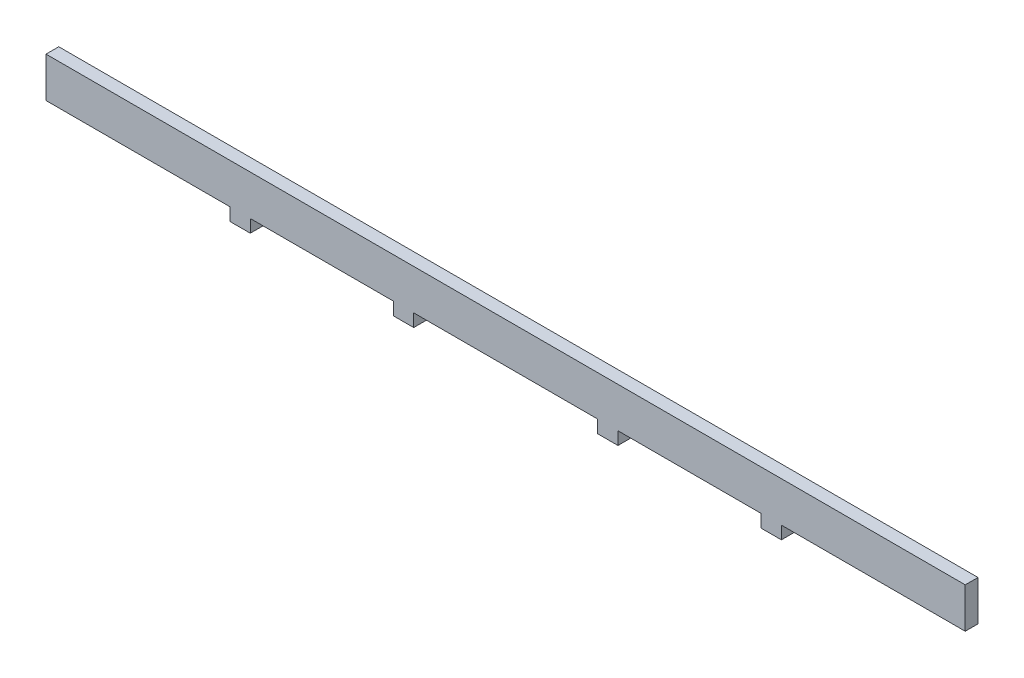
ISO-10303-21;
HEADER;
FILE_DESCRIPTION(('STEP AP214'),'2;1');
FILE_NAME('part.step','',(''),(''),'','','');
FILE_SCHEMA(('AUTOMOTIVE_DESIGN { 1 0 10303 214 1 1 1 1 }'));
ENDSEC;
DATA;
#1=APPLICATION_CONTEXT('core data for automotive mechanical design processes');
#2=APPLICATION_PROTOCOL_DEFINITION('international standard','automotive_design',2000,#1);
#3=PRODUCT_CONTEXT('',#1,'mechanical');
#4=PRODUCT('Part','Part','',(#3));
#5=PRODUCT_RELATED_PRODUCT_CATEGORY('part','',(#4));
#6=PRODUCT_DEFINITION_FORMATION('','',#4);
#7=PRODUCT_DEFINITION_CONTEXT('part definition',#1,'design');
#8=PRODUCT_DEFINITION('design','',#6,#7);
#9=PRODUCT_DEFINITION_SHAPE('','',#8);
#10=(LENGTH_UNIT() NAMED_UNIT(*) SI_UNIT(.MILLI.,.METRE.));
#11=(NAMED_UNIT(*) PLANE_ANGLE_UNIT() SI_UNIT($,.RADIAN.));
#12=(NAMED_UNIT(*) SI_UNIT($,.STERADIAN.) SOLID_ANGLE_UNIT());
#13=UNCERTAINTY_MEASURE_WITH_UNIT(LENGTH_MEASURE(1.E-05),#10,'distance_accuracy_value','');
#14=(GEOMETRIC_REPRESENTATION_CONTEXT(3) GLOBAL_UNCERTAINTY_ASSIGNED_CONTEXT((#13)) GLOBAL_UNIT_ASSIGNED_CONTEXT((#10,
#11,#12)) REPRESENTATION_CONTEXT('',''));
#15=CARTESIAN_POINT('',(0.,0.,0.));
#16=DIRECTION('',(0.,0.,1.));
#17=DIRECTION('',(1.,0.,0.));
#18=AXIS2_PLACEMENT_3D('',#15,#16,#17);
#19=CARTESIAN_POINT('',(-139.427215106676,70.106814657639,3.175));
#20=DIRECTION('',(1.,0.,0.));
#21=DIRECTION('',(0.,1.,0.));
#22=AXIS2_PLACEMENT_3D('',#19,#20,#21);
#23=PLANE('',#22);
#24=DIRECTION('',(0.,-1.,0.));
#25=VECTOR('',#24,1.);
#26=CARTESIAN_POINT('',(-139.427215106676,70.106814657639,0.));
#27=LINE('',#26,#25);
#28=CARTESIAN_POINT('',(-139.427215106676,70.106814657639,0.));
#29=VERTEX_POINT('',#28);
#30=CARTESIAN_POINT('',(-139.427215106676,60.1068146576389,0.));
#31=VERTEX_POINT('',#30);
#32=EDGE_CURVE('E201',#29,#31,#27,.T.);
#33=ORIENTED_EDGE('',*,*,#32,.T.);
#34=DIRECTION('',(0.,0.,-1.));
#35=VECTOR('',#34,1.);
#36=CARTESIAN_POINT('',(-139.427215106676,60.1068146576389,3.175));
#37=LINE('',#36,#35);
#38=CARTESIAN_POINT('',(-139.427215106676,60.1068146576389,3.175));
#39=VERTEX_POINT('',#38);
#40=EDGE_CURVE('E11',#39,#31,#37,.T.);
#41=ORIENTED_EDGE('',*,*,#40,.F.);
#42=DIRECTION('',(0.,-1.,0.));
#43=VECTOR('',#42,1.);
#44=CARTESIAN_POINT('',(-139.427215106676,70.106814657639,3.175));
#45=LINE('',#44,#43);
#46=CARTESIAN_POINT('',(-139.427215106676,70.106814657639,3.175));
#47=VERTEX_POINT('',#46);
#48=EDGE_CURVE('E239',#47,#39,#45,.T.);
#49=ORIENTED_EDGE('',*,*,#48,.F.);
#50=DIRECTION('',(0.,0.,-1.));
#51=VECTOR('',#50,1.);
#52=CARTESIAN_POINT('',(-139.427215106676,70.106814657639,3.175));
#53=LINE('',#52,#51);
#54=EDGE_CURVE('E197',#47,#29,#53,.T.);
#55=ORIENTED_EDGE('',*,*,#54,.T.);
#56=EDGE_LOOP('',(#33,#41,#49,#55));
#57=FACE_BOUND('',#56,.T.);
#58=ADVANCED_FACE('F33',(#57),#23,.F.);
#59=CARTESIAN_POINT('',(-139.427215106676,60.1068146576389,3.175));
#60=DIRECTION('',(0.,1.,0.));
#61=DIRECTION('',(-1.,0.,0.));
#62=AXIS2_PLACEMENT_3D('',#59,#60,#61);
#63=PLANE('',#62);
#64=DIRECTION('',(1.,0.,0.));
#65=VECTOR('',#64,1.);
#66=CARTESIAN_POINT('',(-139.427215106676,60.1068146576389,0.));
#67=LINE('',#66,#65);
#68=CARTESIAN_POINT('',(-93.7072151066765,60.106814657639,0.));
#69=VERTEX_POINT('',#68);
#70=EDGE_CURVE('E204',#31,#69,#67,.T.);
#71=ORIENTED_EDGE('',*,*,#70,.T.);
#72=DIRECTION('',(0.,0.,-1.));
#73=VECTOR('',#72,1.);
#74=CARTESIAN_POINT('',(-93.7072151066765,60.106814657639,3.175));
#75=LINE('',#74,#73);
#76=CARTESIAN_POINT('',(-93.7072151066765,60.106814657639,3.175));
#77=VERTEX_POINT('',#76);
#78=EDGE_CURVE('E41',#77,#69,#75,.T.);
#79=ORIENTED_EDGE('',*,*,#78,.F.);
#80=DIRECTION('',(1.,0.,0.));
#81=VECTOR('',#80,1.);
#82=CARTESIAN_POINT('',(-139.427215106676,60.1068146576389,3.175));
#83=LINE('',#82,#81);
#84=EDGE_CURVE('E128',#39,#77,#83,.T.);
#85=ORIENTED_EDGE('',*,*,#84,.F.);
#86=ORIENTED_EDGE('',*,*,#40,.T.);
#87=EDGE_LOOP('',(#71,#79,#85,#86));
#88=FACE_BOUND('',#87,.T.);
#89=ADVANCED_FACE('F357',(#88),#63,.F.);
#90=CARTESIAN_POINT('',(-93.7072151066765,60.106814657639,3.175));
#91=DIRECTION('',(1.,0.,0.));
#92=DIRECTION('',(0.,0.,-1.));
#93=AXIS2_PLACEMENT_3D('',#90,#91,#92);
#94=PLANE('',#93);
#95=DIRECTION('',(0.,-1.,0.));
#96=VECTOR('',#95,1.);
#97=CARTESIAN_POINT('',(-93.7072151066765,60.106814657639,0.));
#98=LINE('',#97,#96);
#99=CARTESIAN_POINT('',(-93.7072151066765,56.931814657639,0.));
#100=VERTEX_POINT('',#99);
#101=EDGE_CURVE('E206',#69,#100,#98,.T.);
#102=ORIENTED_EDGE('',*,*,#101,.T.);
#103=DIRECTION('',(0.,0.,-1.));
#104=VECTOR('',#103,1.);
#105=CARTESIAN_POINT('',(-93.7072151066765,56.931814657639,3.175));
#106=LINE('',#105,#104);
#107=CARTESIAN_POINT('',(-93.7072151066765,56.931814657639,3.175));
#108=VERTEX_POINT('',#107);
#109=EDGE_CURVE('E282',#108,#100,#106,.T.);
#110=ORIENTED_EDGE('',*,*,#109,.F.);
#111=DIRECTION('',(0.,-1.,0.));
#112=VECTOR('',#111,1.);
#113=CARTESIAN_POINT('',(-93.7072151066765,60.106814657639,3.175));
#114=LINE('',#113,#112);
#115=EDGE_CURVE('E290',#77,#108,#114,.T.);
#116=ORIENTED_EDGE('',*,*,#115,.F.);
#117=ORIENTED_EDGE('',*,*,#78,.T.);
#118=EDGE_LOOP('',(#102,#110,#116,#117));
#119=FACE_BOUND('',#118,.T.);
#120=ADVANCED_FACE('F288',(#119),#94,.F.);
#121=CARTESIAN_POINT('',(-93.7072151066765,56.931814657639,3.175));
#122=DIRECTION('',(0.,1.,0.));
#123=DIRECTION('',(0.,0.,1.));
#124=AXIS2_PLACEMENT_3D('',#121,#122,#123);
#125=PLANE('',#124);
#126=DIRECTION('',(1.,0.,0.));
#127=VECTOR('',#126,1.);
#128=CARTESIAN_POINT('',(-93.7072151066765,56.931814657639,0.));
#129=LINE('',#128,#127);
#130=CARTESIAN_POINT('',(-88.6272151066764,56.931814657639,0.));
#131=VERTEX_POINT('',#130);
#132=EDGE_CURVE('E208',#100,#131,#129,.T.);
#133=ORIENTED_EDGE('',*,*,#132,.T.);
#134=DIRECTION('',(0.,0.,-1.));
#135=VECTOR('',#134,1.);
#136=CARTESIAN_POINT('',(-88.6272151066764,56.931814657639,3.175));
#137=LINE('',#136,#135);
#138=CARTESIAN_POINT('',(-88.6272151066764,56.931814657639,3.175));
#139=VERTEX_POINT('',#138);
#140=EDGE_CURVE('E279',#139,#131,#137,.T.);
#141=ORIENTED_EDGE('',*,*,#140,.F.);
#142=DIRECTION('',(1.,0.,0.));
#143=VECTOR('',#142,1.);
#144=CARTESIAN_POINT('',(-93.7072151066765,56.931814657639,3.175));
#145=LINE('',#144,#143);
#146=EDGE_CURVE('E308',#108,#139,#145,.T.);
#147=ORIENTED_EDGE('',*,*,#146,.F.);
#148=ORIENTED_EDGE('',*,*,#109,.T.);
#149=EDGE_LOOP('',(#133,#141,#147,#148));
#150=FACE_BOUND('',#149,.T.);
#151=ADVANCED_FACE('F299',(#150),#125,.F.);
#152=CARTESIAN_POINT('',(-88.6272151066765,60.106814657639,3.175));
#153=DIRECTION('',(-1.,0.,0.));
#154=DIRECTION('',(0.,-1.,0.));
#155=AXIS2_PLACEMENT_3D('',#152,#153,#154);
#156=PLANE('',#155);
#157=DIRECTION('',(0.,1.,0.));
#158=VECTOR('',#157,1.);
#159=CARTESIAN_POINT('',(-88.6272151066765,60.106814657639,0.));
#160=LINE('',#159,#158);
#161=CARTESIAN_POINT('',(-88.6272151066765,60.106814657639,0.));
#162=VERTEX_POINT('',#161);
#163=EDGE_CURVE('E210',#131,#162,#160,.T.);
#164=ORIENTED_EDGE('',*,*,#163,.T.);
#165=DIRECTION('',(0.,0.,-1.));
#166=VECTOR('',#165,1.);
#167=CARTESIAN_POINT('',(-88.6272151066765,60.106814657639,3.175));
#168=LINE('',#167,#166);
#169=CARTESIAN_POINT('',(-88.6272151066765,60.106814657639,3.175));
#170=VERTEX_POINT('',#169);
#171=EDGE_CURVE('E276',#170,#162,#168,.T.);
#172=ORIENTED_EDGE('',*,*,#171,.F.);
#173=DIRECTION('',(0.,1.,0.));
#174=VECTOR('',#173,1.);
#175=CARTESIAN_POINT('',(-88.6272151066765,60.106814657639,3.175));
#176=LINE('',#175,#174);
#177=EDGE_CURVE('E305',#139,#170,#176,.T.);
#178=ORIENTED_EDGE('',*,*,#177,.F.);
#179=ORIENTED_EDGE('',*,*,#140,.T.);
#180=EDGE_LOOP('',(#164,#172,#178,#179));
#181=FACE_BOUND('',#180,.T.);
#182=ADVANCED_FACE('F303',(#181),#156,.F.);
#183=CARTESIAN_POINT('',(-88.6272151066765,60.106814657639,3.175));
#184=DIRECTION('',(0.,1.,0.));
#185=DIRECTION('',(0.,0.,1.));
#186=AXIS2_PLACEMENT_3D('',#183,#184,#185);
#187=PLANE('',#186);
#188=DIRECTION('',(1.,0.,0.));
#189=VECTOR('',#188,1.);
#190=CARTESIAN_POINT('',(-88.6272151066765,60.106814657639,0.));
#191=LINE('',#190,#189);
#192=CARTESIAN_POINT('',(-53.0672151066765,60.106814657639,0.));
#193=VERTEX_POINT('',#192);
#194=EDGE_CURVE('E212',#162,#193,#191,.T.);
#195=ORIENTED_EDGE('',*,*,#194,.T.);
#196=DIRECTION('',(0.,0.,-1.));
#197=VECTOR('',#196,1.);
#198=CARTESIAN_POINT('',(-53.0672151066765,60.106814657639,3.175));
#199=LINE('',#198,#197);
#200=CARTESIAN_POINT('',(-53.0672151066765,60.106814657639,3.175));
#201=VERTEX_POINT('',#200);
#202=EDGE_CURVE('E273',#201,#193,#199,.T.);
#203=ORIENTED_EDGE('',*,*,#202,.F.);
#204=DIRECTION('',(1.,0.,0.));
#205=VECTOR('',#204,1.);
#206=CARTESIAN_POINT('',(-88.6272151066765,60.106814657639,3.175));
#207=LINE('',#206,#205);
#208=EDGE_CURVE('E307',#170,#201,#207,.T.);
#209=ORIENTED_EDGE('',*,*,#208,.F.);
#210=ORIENTED_EDGE('',*,*,#171,.T.);
#211=EDGE_LOOP('',(#195,#203,#209,#210));
#212=FACE_BOUND('',#211,.T.);
#213=ADVANCED_FACE('F370',(#212),#187,.F.);
#214=CARTESIAN_POINT('',(-53.0672151066765,60.106814657639,3.175));
#215=DIRECTION('',(1.,0.,0.));
#216=DIRECTION('',(0.,0.,-1.));
#217=AXIS2_PLACEMENT_3D('',#214,#215,#216);
#218=PLANE('',#217);
#219=DIRECTION('',(0.,-1.,0.));
#220=VECTOR('',#219,1.);
#221=CARTESIAN_POINT('',(-53.0672151066765,60.106814657639,0.));
#222=LINE('',#221,#220);
#223=CARTESIAN_POINT('',(-53.0672151066765,56.931814657639,0.));
#224=VERTEX_POINT('',#223);
#225=EDGE_CURVE('E214',#193,#224,#222,.T.);
#226=ORIENTED_EDGE('',*,*,#225,.T.);
#227=DIRECTION('',(0.,0.,-1.));
#228=VECTOR('',#227,1.);
#229=CARTESIAN_POINT('',(-53.0672151066765,56.931814657639,3.175));
#230=LINE('',#229,#228);
#231=CARTESIAN_POINT('',(-53.0672151066765,56.931814657639,3.175));
#232=VERTEX_POINT('',#231);
#233=EDGE_CURVE('E270',#232,#224,#230,.T.);
#234=ORIENTED_EDGE('',*,*,#233,.F.);
#235=DIRECTION('',(0.,-1.,0.));
#236=VECTOR('',#235,1.);
#237=CARTESIAN_POINT('',(-53.0672151066765,60.106814657639,3.175));
#238=LINE('',#237,#236);
#239=EDGE_CURVE('E310',#201,#232,#238,.T.);
#240=ORIENTED_EDGE('',*,*,#239,.F.);
#241=ORIENTED_EDGE('',*,*,#202,.T.);
#242=EDGE_LOOP('',(#226,#234,#240,#241));
#243=FACE_BOUND('',#242,.T.);
#244=ADVANCED_FACE('F373',(#243),#218,.F.);
#245=CARTESIAN_POINT('',(-53.0672151066765,56.931814657639,3.175));
#246=DIRECTION('',(0.,1.,0.));
#247=DIRECTION('',(0.,0.,1.));
#248=AXIS2_PLACEMENT_3D('',#245,#246,#247);
#249=PLANE('',#248);
#250=DIRECTION('',(1.,0.,0.));
#251=VECTOR('',#250,1.);
#252=CARTESIAN_POINT('',(-53.0672151066765,56.931814657639,0.));
#253=LINE('',#252,#251);
#254=CARTESIAN_POINT('',(-47.9872151066765,56.931814657639,0.));
#255=VERTEX_POINT('',#254);
#256=EDGE_CURVE('E216',#224,#255,#253,.T.);
#257=ORIENTED_EDGE('',*,*,#256,.T.);
#258=DIRECTION('',(0.,0.,-1.));
#259=VECTOR('',#258,1.);
#260=CARTESIAN_POINT('',(-47.9872151066765,56.931814657639,3.175));
#261=LINE('',#260,#259);
#262=CARTESIAN_POINT('',(-47.9872151066765,56.931814657639,3.175));
#263=VERTEX_POINT('',#262);
#264=EDGE_CURVE('E267',#263,#255,#261,.T.);
#265=ORIENTED_EDGE('',*,*,#264,.F.);
#266=DIRECTION('',(1.,0.,0.));
#267=VECTOR('',#266,1.);
#268=CARTESIAN_POINT('',(-53.0672151066765,56.931814657639,3.175));
#269=LINE('',#268,#267);
#270=EDGE_CURVE('E316',#232,#263,#269,.T.);
#271=ORIENTED_EDGE('',*,*,#270,.F.);
#272=ORIENTED_EDGE('',*,*,#233,.T.);
#273=EDGE_LOOP('',(#257,#265,#271,#272));
#274=FACE_BOUND('',#273,.T.);
#275=ADVANCED_FACE('F377',(#274),#249,.F.);
#276=CARTESIAN_POINT('',(-47.9872151066765,60.106814657639,3.175));
#277=DIRECTION('',(-1.,0.,0.));
#278=DIRECTION('',(0.,0.,1.));
#279=AXIS2_PLACEMENT_3D('',#276,#277,#278);
#280=PLANE('',#279);
#281=DIRECTION('',(0.,1.,0.));
#282=VECTOR('',#281,1.);
#283=CARTESIAN_POINT('',(-47.9872151066765,60.106814657639,0.));
#284=LINE('',#283,#282);
#285=CARTESIAN_POINT('',(-47.9872151066765,60.106814657639,0.));
#286=VERTEX_POINT('',#285);
#287=EDGE_CURVE('E218',#255,#286,#284,.T.);
#288=ORIENTED_EDGE('',*,*,#287,.T.);
#289=DIRECTION('',(0.,0.,-1.));
#290=VECTOR('',#289,1.);
#291=CARTESIAN_POINT('',(-47.9872151066765,60.106814657639,3.175));
#292=LINE('',#291,#290);
#293=CARTESIAN_POINT('',(-47.9872151066765,60.106814657639,3.175));
#294=VERTEX_POINT('',#293);
#295=EDGE_CURVE('E264',#294,#286,#292,.T.);
#296=ORIENTED_EDGE('',*,*,#295,.F.);
#297=DIRECTION('',(0.,1.,0.));
#298=VECTOR('',#297,1.);
#299=CARTESIAN_POINT('',(-47.9872151066765,60.106814657639,3.175));
#300=LINE('',#299,#298);
#301=EDGE_CURVE('E318',#263,#294,#300,.T.);
#302=ORIENTED_EDGE('',*,*,#301,.F.);
#303=ORIENTED_EDGE('',*,*,#264,.T.);
#304=EDGE_LOOP('',(#288,#296,#302,#303));
#305=FACE_BOUND('',#304,.T.);
#306=ADVANCED_FACE('F381',(#305),#280,.F.);
#307=CARTESIAN_POINT('',(-47.9872151066765,60.106814657639,3.175));
#308=DIRECTION('',(0.,1.,0.));
#309=DIRECTION('',(-1.,0.,0.));
#310=AXIS2_PLACEMENT_3D('',#307,#308,#309);
#311=PLANE('',#310);
#312=DIRECTION('',(1.,0.,0.));
#313=VECTOR('',#312,1.);
#314=CARTESIAN_POINT('',(-47.9872151066765,60.106814657639,0.));
#315=LINE('',#314,#313);
#316=CARTESIAN_POINT('',(-2.26721510667649,60.1068146576389,0.));
#317=VERTEX_POINT('',#316);
#318=EDGE_CURVE('E220',#286,#317,#315,.T.);
#319=ORIENTED_EDGE('',*,*,#318,.T.);
#320=DIRECTION('',(0.,0.,-1.));
#321=VECTOR('',#320,1.);
#322=CARTESIAN_POINT('',(-2.26721510667649,60.1068146576389,3.175));
#323=LINE('',#322,#321);
#324=CARTESIAN_POINT('',(-2.26721510667649,60.1068146576389,3.175));
#325=VERTEX_POINT('',#324);
#326=EDGE_CURVE('E261',#325,#317,#323,.T.);
#327=ORIENTED_EDGE('',*,*,#326,.F.);
#328=DIRECTION('',(1.,0.,0.));
#329=VECTOR('',#328,1.);
#330=CARTESIAN_POINT('',(-47.9872151066765,60.106814657639,3.175));
#331=LINE('',#330,#329);
#332=EDGE_CURVE('E320',#294,#325,#331,.T.);
#333=ORIENTED_EDGE('',*,*,#332,.F.);
#334=ORIENTED_EDGE('',*,*,#295,.T.);
#335=EDGE_LOOP('',(#319,#327,#333,#334));
#336=FACE_BOUND('',#335,.T.);
#337=ADVANCED_FACE('F385',(#336),#311,.F.);
#338=CARTESIAN_POINT('',(-2.26721510667649,60.1068146576389,3.175));
#339=DIRECTION('',(1.,0.,0.));
#340=DIRECTION('',(0.,1.,0.));
#341=AXIS2_PLACEMENT_3D('',#338,#339,#340);
#342=PLANE('',#341);
#343=DIRECTION('',(0.,-1.,0.));
#344=VECTOR('',#343,1.);
#345=CARTESIAN_POINT('',(-2.26721510667649,60.1068146576389,0.));
#346=LINE('',#345,#344);
#347=CARTESIAN_POINT('',(-2.26721510667649,56.931814657639,0.));
#348=VERTEX_POINT('',#347);
#349=EDGE_CURVE('E222',#317,#348,#346,.T.);
#350=ORIENTED_EDGE('',*,*,#349,.T.);
#351=DIRECTION('',(0.,0.,-1.));
#352=VECTOR('',#351,1.);
#353=CARTESIAN_POINT('',(-2.26721510667649,56.931814657639,3.175));
#354=LINE('',#353,#352);
#355=CARTESIAN_POINT('',(-2.26721510667649,56.931814657639,3.175));
#356=VERTEX_POINT('',#355);
#357=EDGE_CURVE('E258',#356,#348,#354,.T.);
#358=ORIENTED_EDGE('',*,*,#357,.F.);
#359=DIRECTION('',(0.,-1.,0.));
#360=VECTOR('',#359,1.);
#361=CARTESIAN_POINT('',(-2.26721510667649,60.1068146576389,3.175));
#362=LINE('',#361,#360);
#363=EDGE_CURVE('E322',#325,#356,#362,.T.);
#364=ORIENTED_EDGE('',*,*,#363,.F.);
#365=ORIENTED_EDGE('',*,*,#326,.T.);
#366=EDGE_LOOP('',(#350,#358,#364,#365));
#367=FACE_BOUND('',#366,.T.);
#368=ADVANCED_FACE('F389',(#367),#342,.F.);
#369=CARTESIAN_POINT('',(-2.26721510667649,56.931814657639,3.175));
#370=DIRECTION('',(0.,1.,0.));
#371=DIRECTION('',(0.,0.,1.));
#372=AXIS2_PLACEMENT_3D('',#369,#370,#371);
#373=PLANE('',#372);
#374=DIRECTION('',(1.,0.,0.));
#375=VECTOR('',#374,1.);
#376=CARTESIAN_POINT('',(-2.26721510667649,56.931814657639,0.));
#377=LINE('',#376,#375);
#378=CARTESIAN_POINT('',(2.81278489332351,56.931814657639,0.));
#379=VERTEX_POINT('',#378);
#380=EDGE_CURVE('E224',#348,#379,#377,.T.);
#381=ORIENTED_EDGE('',*,*,#380,.T.);
#382=DIRECTION('',(0.,0.,-1.));
#383=VECTOR('',#382,1.);
#384=CARTESIAN_POINT('',(2.81278489332351,56.931814657639,3.175));
#385=LINE('',#384,#383);
#386=CARTESIAN_POINT('',(2.81278489332351,56.931814657639,3.175));
#387=VERTEX_POINT('',#386);
#388=EDGE_CURVE('E255',#387,#379,#385,.T.);
#389=ORIENTED_EDGE('',*,*,#388,.F.);
#390=DIRECTION('',(1.,0.,0.));
#391=VECTOR('',#390,1.);
#392=CARTESIAN_POINT('',(-2.26721510667649,56.931814657639,3.175));
#393=LINE('',#392,#391);
#394=EDGE_CURVE('E324',#356,#387,#393,.T.);
#395=ORIENTED_EDGE('',*,*,#394,.F.);
#396=ORIENTED_EDGE('',*,*,#357,.T.);
#397=EDGE_LOOP('',(#381,#389,#395,#396));
#398=FACE_BOUND('',#397,.T.);
#399=ADVANCED_FACE('F393',(#398),#373,.F.);
#400=CARTESIAN_POINT('',(2.81278489332351,60.1068146576389,3.175));
#401=DIRECTION('',(-1.,0.,0.));
#402=DIRECTION('',(0.,0.,1.));
#403=AXIS2_PLACEMENT_3D('',#400,#401,#402);
#404=PLANE('',#403);
#405=DIRECTION('',(0.,1.,0.));
#406=VECTOR('',#405,1.);
#407=CARTESIAN_POINT('',(2.81278489332351,60.1068146576389,0.));
#408=LINE('',#407,#406);
#409=CARTESIAN_POINT('',(2.81278489332351,60.1068146576389,0.));
#410=VERTEX_POINT('',#409);
#411=EDGE_CURVE('E226',#379,#410,#408,.T.);
#412=ORIENTED_EDGE('',*,*,#411,.T.);
#413=DIRECTION('',(0.,0.,-1.));
#414=VECTOR('',#413,1.);
#415=CARTESIAN_POINT('',(2.81278489332351,60.1068146576389,3.175));
#416=LINE('',#415,#414);
#417=CARTESIAN_POINT('',(2.81278489332351,60.1068146576389,3.175));
#418=VERTEX_POINT('',#417);
#419=EDGE_CURVE('E252',#418,#410,#416,.T.);
#420=ORIENTED_EDGE('',*,*,#419,.F.);
#421=DIRECTION('',(0.,1.,0.));
#422=VECTOR('',#421,1.);
#423=CARTESIAN_POINT('',(2.81278489332351,60.1068146576389,3.175));
#424=LINE('',#423,#422);
#425=EDGE_CURVE('E326',#387,#418,#424,.T.);
#426=ORIENTED_EDGE('',*,*,#425,.F.);
#427=ORIENTED_EDGE('',*,*,#388,.T.);
#428=EDGE_LOOP('',(#412,#420,#426,#427));
#429=FACE_BOUND('',#428,.T.);
#430=ADVANCED_FACE('F397',(#429),#404,.F.);
#431=CARTESIAN_POINT('',(2.81278489332351,60.1068146576389,3.175));
#432=DIRECTION('',(0.,1.,0.));
#433=DIRECTION('',(0.,0.,1.));
#434=AXIS2_PLACEMENT_3D('',#431,#432,#433);
#435=PLANE('',#434);
#436=DIRECTION('',(1.,0.,0.));
#437=VECTOR('',#436,1.);
#438=CARTESIAN_POINT('',(2.81278489332351,60.1068146576389,0.));
#439=LINE('',#438,#437);
#440=CARTESIAN_POINT('',(38.3727848933235,60.1068146576389,0.));
#441=VERTEX_POINT('',#440);
#442=EDGE_CURVE('E228',#410,#441,#439,.T.);
#443=ORIENTED_EDGE('',*,*,#442,.T.);
#444=DIRECTION('',(0.,0.,-1.));
#445=VECTOR('',#444,1.);
#446=CARTESIAN_POINT('',(38.3727848933235,60.1068146576389,3.175));
#447=LINE('',#446,#445);
#448=CARTESIAN_POINT('',(38.3727848933235,60.1068146576389,3.175));
#449=VERTEX_POINT('',#448);
#450=EDGE_CURVE('E249',#449,#441,#447,.T.);
#451=ORIENTED_EDGE('',*,*,#450,.F.);
#452=DIRECTION('',(1.,0.,0.));
#453=VECTOR('',#452,1.);
#454=CARTESIAN_POINT('',(2.81278489332351,60.1068146576389,3.175));
#455=LINE('',#454,#453);
#456=EDGE_CURVE('E328',#418,#449,#455,.T.);
#457=ORIENTED_EDGE('',*,*,#456,.F.);
#458=ORIENTED_EDGE('',*,*,#419,.T.);
#459=EDGE_LOOP('',(#443,#451,#457,#458));
#460=FACE_BOUND('',#459,.T.);
#461=ADVANCED_FACE('F401',(#460),#435,.F.);
#462=CARTESIAN_POINT('',(38.3727848933235,60.1068146576389,3.175));
#463=DIRECTION('',(1.,0.,0.));
#464=DIRECTION('',(0.,0.,-1.));
#465=AXIS2_PLACEMENT_3D('',#462,#463,#464);
#466=PLANE('',#465);
#467=DIRECTION('',(0.,-1.,0.));
#468=VECTOR('',#467,1.);
#469=CARTESIAN_POINT('',(38.3727848933235,60.1068146576389,0.));
#470=LINE('',#469,#468);
#471=CARTESIAN_POINT('',(38.3727848933235,56.931814657639,0.));
#472=VERTEX_POINT('',#471);
#473=EDGE_CURVE('E230',#441,#472,#470,.T.);
#474=ORIENTED_EDGE('',*,*,#473,.T.);
#475=DIRECTION('',(0.,0.,-1.));
#476=VECTOR('',#475,1.);
#477=CARTESIAN_POINT('',(38.3727848933235,56.931814657639,3.175));
#478=LINE('',#477,#476);
#479=CARTESIAN_POINT('',(38.3727848933235,56.931814657639,3.175));
#480=VERTEX_POINT('',#479);
#481=EDGE_CURVE('E246',#480,#472,#478,.T.);
#482=ORIENTED_EDGE('',*,*,#481,.F.);
#483=DIRECTION('',(0.,-1.,0.));
#484=VECTOR('',#483,1.);
#485=CARTESIAN_POINT('',(38.3727848933235,60.1068146576389,3.175));
#486=LINE('',#485,#484);
#487=EDGE_CURVE('E330',#449,#480,#486,.T.);
#488=ORIENTED_EDGE('',*,*,#487,.F.);
#489=ORIENTED_EDGE('',*,*,#450,.T.);
#490=EDGE_LOOP('',(#474,#482,#488,#489));
#491=FACE_BOUND('',#490,.T.);
#492=ADVANCED_FACE('F405',(#491),#466,.F.);
#493=CARTESIAN_POINT('',(38.3727848933235,56.931814657639,3.175));
#494=DIRECTION('',(0.,1.,0.));
#495=DIRECTION('',(-1.,0.,0.));
#496=AXIS2_PLACEMENT_3D('',#493,#494,#495);
#497=PLANE('',#496);
#498=DIRECTION('',(1.,0.,0.));
#499=VECTOR('',#498,1.);
#500=CARTESIAN_POINT('',(38.3727848933235,56.931814657639,0.));
#501=LINE('',#500,#499);
#502=CARTESIAN_POINT('',(43.4527848933235,56.931814657639,0.));
#503=VERTEX_POINT('',#502);
#504=EDGE_CURVE('E232',#472,#503,#501,.T.);
#505=ORIENTED_EDGE('',*,*,#504,.T.);
#506=DIRECTION('',(0.,0.,-1.));
#507=VECTOR('',#506,1.);
#508=CARTESIAN_POINT('',(43.4527848933235,56.931814657639,3.175));
#509=LINE('',#508,#507);
#510=CARTESIAN_POINT('',(43.4527848933235,56.931814657639,3.175));
#511=VERTEX_POINT('',#510);
#512=EDGE_CURVE('E243',#511,#503,#509,.T.);
#513=ORIENTED_EDGE('',*,*,#512,.F.);
#514=DIRECTION('',(1.,0.,0.));
#515=VECTOR('',#514,1.);
#516=CARTESIAN_POINT('',(38.3727848933235,56.931814657639,3.175));
#517=LINE('',#516,#515);
#518=EDGE_CURVE('E332',#480,#511,#517,.T.);
#519=ORIENTED_EDGE('',*,*,#518,.F.);
#520=ORIENTED_EDGE('',*,*,#481,.T.);
#521=EDGE_LOOP('',(#505,#513,#519,#520));
#522=FACE_BOUND('',#521,.T.);
#523=ADVANCED_FACE('F338',(#522),#497,.F.);
#524=CARTESIAN_POINT('',(43.4527848933235,60.106814657639,3.175));
#525=DIRECTION('',(-1.,0.,0.));
#526=DIRECTION('',(0.,-1.,0.));
#527=AXIS2_PLACEMENT_3D('',#524,#525,#526);
#528=PLANE('',#527);
#529=DIRECTION('',(0.,1.,0.));
#530=VECTOR('',#529,1.);
#531=CARTESIAN_POINT('',(43.4527848933235,60.106814657639,0.));
#532=LINE('',#531,#530);
#533=CARTESIAN_POINT('',(43.4527848933235,60.106814657639,0.));
#534=VERTEX_POINT('',#533);
#535=EDGE_CURVE('E234',#503,#534,#532,.T.);
#536=ORIENTED_EDGE('',*,*,#535,.T.);
#537=DIRECTION('',(0.,0.,-1.));
#538=VECTOR('',#537,1.);
#539=CARTESIAN_POINT('',(43.4527848933235,60.106814657639,3.175));
#540=LINE('',#539,#538);
#541=CARTESIAN_POINT('',(43.4527848933235,60.106814657639,3.175));
#542=VERTEX_POINT('',#541);
#543=EDGE_CURVE('E192',#542,#534,#540,.T.);
#544=ORIENTED_EDGE('',*,*,#543,.F.);
#545=DIRECTION('',(0.,1.,0.));
#546=VECTOR('',#545,1.);
#547=CARTESIAN_POINT('',(43.4527848933235,60.106814657639,3.175));
#548=LINE('',#547,#546);
#549=EDGE_CURVE('E183',#511,#542,#548,.T.);
#550=ORIENTED_EDGE('',*,*,#549,.F.);
#551=ORIENTED_EDGE('',*,*,#512,.T.);
#552=EDGE_LOOP('',(#536,#544,#550,#551));
#553=FACE_BOUND('',#552,.T.);
#554=ADVANCED_FACE('F342',(#553),#528,.F.);
#555=CARTESIAN_POINT('',(43.4527848933235,60.106814657639,3.175));
#556=DIRECTION('',(0.,1.,0.));
#557=DIRECTION('',(0.,0.,1.));
#558=AXIS2_PLACEMENT_3D('',#555,#556,#557);
#559=PLANE('',#558);
#560=DIRECTION('',(1.,0.,0.));
#561=VECTOR('',#560,1.);
#562=CARTESIAN_POINT('',(43.4527848933235,60.106814657639,0.));
#563=LINE('',#562,#561);
#564=CARTESIAN_POINT('',(89.1727848933235,60.106814657639,0.));
#565=VERTEX_POINT('',#564);
#566=EDGE_CURVE('E191',#534,#565,#563,.T.);
#567=ORIENTED_EDGE('',*,*,#566,.T.);
#568=DIRECTION('',(0.,0.,-1.));
#569=VECTOR('',#568,1.);
#570=CARTESIAN_POINT('',(89.1727848933235,60.106814657639,3.175));
#571=LINE('',#570,#569);
#572=CARTESIAN_POINT('',(89.1727848933235,60.106814657639,3.175));
#573=VERTEX_POINT('',#572);
#574=EDGE_CURVE('E188',#573,#565,#571,.T.);
#575=ORIENTED_EDGE('',*,*,#574,.F.);
#576=DIRECTION('',(1.,0.,0.));
#577=VECTOR('',#576,1.);
#578=CARTESIAN_POINT('',(43.4527848933235,60.106814657639,3.175));
#579=LINE('',#578,#577);
#580=EDGE_CURVE('E177',#542,#573,#579,.T.);
#581=ORIENTED_EDGE('',*,*,#580,.F.);
#582=ORIENTED_EDGE('',*,*,#543,.T.);
#583=EDGE_LOOP('',(#567,#575,#581,#582));
#584=FACE_BOUND('',#583,.T.);
#585=ADVANCED_FACE('F189',(#584),#559,.F.);
#586=CARTESIAN_POINT('',(89.1727848933235,70.106814657639,3.175));
#587=DIRECTION('',(-1.,0.,0.));
#588=DIRECTION('',(0.,0.,1.));
#589=AXIS2_PLACEMENT_3D('',#586,#587,#588);
#590=PLANE('',#589);
#591=DIRECTION('',(0.,1.,0.));
#592=VECTOR('',#591,1.);
#593=CARTESIAN_POINT('',(89.1727848933235,70.106814657639,0.));
#594=LINE('',#593,#592);
#595=CARTESIAN_POINT('',(89.1727848933235,70.106814657639,0.));
#596=VERTEX_POINT('',#595);
#597=EDGE_CURVE('E114',#565,#596,#594,.T.);
#598=ORIENTED_EDGE('',*,*,#597,.T.);
#599=DIRECTION('',(0.,0.,-1.));
#600=VECTOR('',#599,1.);
#601=CARTESIAN_POINT('',(89.1727848933235,70.106814657639,3.175));
#602=LINE('',#601,#600);
#603=CARTESIAN_POINT('',(89.1727848933235,70.106814657639,3.175));
#604=VERTEX_POINT('',#603);
#605=EDGE_CURVE('E193',#604,#596,#602,.T.);
#606=ORIENTED_EDGE('',*,*,#605,.F.);
#607=DIRECTION('',(0.,1.,0.));
#608=VECTOR('',#607,1.);
#609=CARTESIAN_POINT('',(89.1727848933235,70.106814657639,3.175));
#610=LINE('',#609,#608);
#611=EDGE_CURVE('E181',#573,#604,#610,.T.);
#612=ORIENTED_EDGE('',*,*,#611,.F.);
#613=ORIENTED_EDGE('',*,*,#574,.T.);
#614=EDGE_LOOP('',(#598,#606,#612,#613));
#615=FACE_BOUND('',#614,.T.);
#616=ADVANCED_FACE('F195',(#615),#590,.F.);
#617=CARTESIAN_POINT('',(-139.427215106676,70.106814657639,3.175));
#618=DIRECTION('',(0.,-1.,0.));
#619=DIRECTION('',(0.,0.,-1.));
#620=AXIS2_PLACEMENT_3D('',#617,#618,#619);
#621=PLANE('',#620);
#622=DIRECTION('',(-1.,0.,0.));
#623=VECTOR('',#622,1.);
#624=CARTESIAN_POINT('',(-139.427215106676,70.106814657639,0.));
#625=LINE('',#624,#623);
#626=EDGE_CURVE('E120',#596,#29,#625,.T.);
#627=ORIENTED_EDGE('',*,*,#626,.T.);
#628=ORIENTED_EDGE('',*,*,#54,.F.);
#629=DIRECTION('',(-1.,0.,0.));
#630=VECTOR('',#629,1.);
#631=CARTESIAN_POINT('',(-139.427215106676,70.106814657639,3.175));
#632=LINE('',#631,#630);
#633=EDGE_CURVE('E49',#604,#47,#632,.T.);
#634=ORIENTED_EDGE('',*,*,#633,.F.);
#635=ORIENTED_EDGE('',*,*,#605,.T.);
#636=EDGE_LOOP('',(#627,#628,#634,#635));
#637=FACE_BOUND('',#636,.T.);
#638=ADVANCED_FACE('F346',(#637),#621,.F.);
#639=CARTESIAN_POINT('',(0.,0.,3.175));
#640=DIRECTION('',(0.,0.,1.));
#641=DIRECTION('',(1.,0.,0.));
#642=AXIS2_PLACEMENT_3D('',#639,#640,#641);
#643=PLANE('',#642);
#644=ORIENTED_EDGE('',*,*,#48,.T.);
#645=ORIENTED_EDGE('',*,*,#84,.T.);
#646=ORIENTED_EDGE('',*,*,#115,.T.);
#647=ORIENTED_EDGE('',*,*,#146,.T.);
#648=ORIENTED_EDGE('',*,*,#177,.T.);
#649=ORIENTED_EDGE('',*,*,#208,.T.);
#650=ORIENTED_EDGE('',*,*,#239,.T.);
#651=ORIENTED_EDGE('',*,*,#270,.T.);
#652=ORIENTED_EDGE('',*,*,#301,.T.);
#653=ORIENTED_EDGE('',*,*,#332,.T.);
#654=ORIENTED_EDGE('',*,*,#363,.T.);
#655=ORIENTED_EDGE('',*,*,#394,.T.);
#656=ORIENTED_EDGE('',*,*,#425,.T.);
#657=ORIENTED_EDGE('',*,*,#456,.T.);
#658=ORIENTED_EDGE('',*,*,#487,.T.);
#659=ORIENTED_EDGE('',*,*,#518,.T.);
#660=ORIENTED_EDGE('',*,*,#549,.T.);
#661=ORIENTED_EDGE('',*,*,#580,.T.);
#662=ORIENTED_EDGE('',*,*,#611,.T.);
#663=ORIENTED_EDGE('',*,*,#633,.T.);
#664=EDGE_LOOP('',(#644,#645,#646,#647,#648,#649,#650,#651,#652,#653,#654,#655,#656,#657,#658,
#659,#660,#661,#662,#663));
#665=FACE_BOUND('',#664,.T.);
#666=ADVANCED_FACE('F179',(#665),#643,.T.);
#667=CARTESIAN_POINT('',(0.,0.,0.));
#668=DIRECTION('',(0.,0.,1.));
#669=DIRECTION('',(1.,0.,0.));
#670=AXIS2_PLACEMENT_3D('',#667,#668,#669);
#671=PLANE('',#670);
#672=ORIENTED_EDGE('',*,*,#32,.F.);
#673=ORIENTED_EDGE('',*,*,#626,.F.);
#674=ORIENTED_EDGE('',*,*,#597,.F.);
#675=ORIENTED_EDGE('',*,*,#566,.F.);
#676=ORIENTED_EDGE('',*,*,#535,.F.);
#677=ORIENTED_EDGE('',*,*,#504,.F.);
#678=ORIENTED_EDGE('',*,*,#473,.F.);
#679=ORIENTED_EDGE('',*,*,#442,.F.);
#680=ORIENTED_EDGE('',*,*,#411,.F.);
#681=ORIENTED_EDGE('',*,*,#380,.F.);
#682=ORIENTED_EDGE('',*,*,#349,.F.);
#683=ORIENTED_EDGE('',*,*,#318,.F.);
#684=ORIENTED_EDGE('',*,*,#287,.F.);
#685=ORIENTED_EDGE('',*,*,#256,.F.);
#686=ORIENTED_EDGE('',*,*,#225,.F.);
#687=ORIENTED_EDGE('',*,*,#194,.F.);
#688=ORIENTED_EDGE('',*,*,#163,.F.);
#689=ORIENTED_EDGE('',*,*,#132,.F.);
#690=ORIENTED_EDGE('',*,*,#101,.F.);
#691=ORIENTED_EDGE('',*,*,#70,.F.);
#692=EDGE_LOOP('',(#672,#673,#674,#675,#676,#677,#678,#679,#680,#681,#682,#683,#684,#685,#686,
#687,#688,#689,#690,#691));
#693=FACE_BOUND('',#692,.T.);
#694=ADVANCED_FACE('F294',(#693),#671,.F.);
#695=CLOSED_SHELL('',(#58,#89,#120,#151,#182,#213,#244,#275,#306,#337,#368,#399,#430,#461,#492,
#523,#554,#585,#616,#638,#666,#694));
#696=MANIFOLD_SOLID_BREP('B2',#695);
#697=ADVANCED_BREP_SHAPE_REPRESENTATION('',(#18,#696),#14);
#698=SHAPE_DEFINITION_REPRESENTATION(#9,#697);
ENDSEC;
END-ISO-10303-21;
